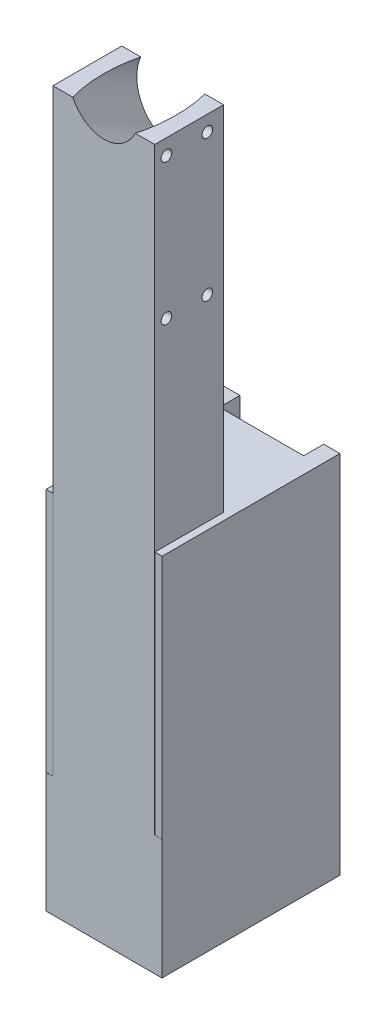
ISO-10303-21;
HEADER;
FILE_DESCRIPTION(('STEP AP214'),'2;1');
FILE_NAME('part.step','',(''),(''),'','','');
FILE_SCHEMA(('AUTOMOTIVE_DESIGN { 1 0 10303 214 1 1 1 1 }'));
ENDSEC;
DATA;
#1=APPLICATION_CONTEXT('core data for automotive mechanical design processes');
#2=APPLICATION_PROTOCOL_DEFINITION('international standard','automotive_design',2000,#1);
#3=PRODUCT_CONTEXT('',#1,'mechanical');
#4=PRODUCT('Part','Part','',(#3));
#5=PRODUCT_RELATED_PRODUCT_CATEGORY('part','',(#4));
#6=PRODUCT_DEFINITION_FORMATION('','',#4);
#7=PRODUCT_DEFINITION_CONTEXT('part definition',#1,'design');
#8=PRODUCT_DEFINITION('design','',#6,#7);
#9=PRODUCT_DEFINITION_SHAPE('','',#8);
#10=(LENGTH_UNIT() NAMED_UNIT(*) SI_UNIT(.MILLI.,.METRE.));
#11=(NAMED_UNIT(*) PLANE_ANGLE_UNIT() SI_UNIT($,.RADIAN.));
#12=(NAMED_UNIT(*) SI_UNIT($,.STERADIAN.) SOLID_ANGLE_UNIT());
#13=UNCERTAINTY_MEASURE_WITH_UNIT(LENGTH_MEASURE(1.E-05),#10,'distance_accuracy_value','');
#14=(GEOMETRIC_REPRESENTATION_CONTEXT(3) GLOBAL_UNCERTAINTY_ASSIGNED_CONTEXT((#13)) GLOBAL_UNIT_ASSIGNED_CONTEXT((#10,
#11,#12)) REPRESENTATION_CONTEXT('',''));
#15=CARTESIAN_POINT('',(0.,0.,0.));
#16=DIRECTION('',(0.,0.,1.));
#17=DIRECTION('',(1.,0.,0.));
#18=AXIS2_PLACEMENT_3D('',#15,#16,#17);
#19=CARTESIAN_POINT('',(4669.28789446627,-4525.12840812318,108.534705239457));
#20=DIRECTION('',(0.,1.,0.));
#21=DIRECTION('',(0.,0.,1.));
#22=AXIS2_PLACEMENT_3D('',#19,#20,#21);
#23=PLANE('',#22);
#24=DIRECTION('',(-1.,0.,0.));
#25=VECTOR('',#24,1.);
#26=CARTESIAN_POINT('',(4620.00818872536,-4525.12840812318,16.7710006429915));
#27=LINE('',#26,#25);
#28=CARTESIAN_POINT('',(4636.00818872536,-4525.12840812318,16.7710006429915));
#29=VERTEX_POINT('',#28);
#30=CARTESIAN_POINT('',(4620.00818872536,-4525.12840812318,16.7710006429915));
#31=VERTEX_POINT('',#30);
#32=EDGE_CURVE('E239',#29,#31,#27,.T.);
#33=ORIENTED_EDGE('',*,*,#32,.F.);
#34=DIRECTION('',(0.,0.,1.));
#35=VECTOR('',#34,1.);
#36=CARTESIAN_POINT('',(4636.00818872536,-4525.12840812318,11.7710006429915));
#37=LINE('',#36,#35);
#38=CARTESIAN_POINT('',(4636.00818872536,-4525.12840812318,11.7710006429915));
#39=VERTEX_POINT('',#38);
#40=EDGE_CURVE('E242',#39,#29,#37,.T.);
#41=ORIENTED_EDGE('',*,*,#40,.F.);
#42=DIRECTION('',(-1.,0.,0.));
#43=VECTOR('',#42,1.);
#44=CARTESIAN_POINT('',(4636.00818872536,-4525.12840812318,11.7710006429915));
#45=LINE('',#44,#43);
#46=CARTESIAN_POINT('',(4642.46950223067,-4525.12840812318,11.7710006429915));
#47=VERTEX_POINT('',#46);
#48=EDGE_CURVE('E245',#47,#39,#45,.T.);
#49=ORIENTED_EDGE('',*,*,#48,.F.);
#50=DIRECTION('',(0.,0.,-1.));
#51=VECTOR('',#50,1.);
#52=CARTESIAN_POINT('',(4642.46950223067,-4525.12840812318,11.7710006429915));
#53=LINE('',#52,#51);
#54=CARTESIAN_POINT('',(4642.46950223067,-4525.12840812318,56.1805924378811));
#55=VERTEX_POINT('',#54);
#56=EDGE_CURVE('E247',#55,#47,#53,.T.);
#57=ORIENTED_EDGE('',*,*,#56,.F.);
#58=DIRECTION('',(1.,0.,0.));
#59=VECTOR('',#58,1.);
#60=CARTESIAN_POINT('',(4615.26193548389,-4525.12840812318,56.1805924378811));
#61=LINE('',#60,#59);
#62=CARTESIAN_POINT('',(4613.54687522005,-4525.12840812318,56.1805924378811));
#63=VERTEX_POINT('',#62);
#64=EDGE_CURVE('E299',#63,#55,#61,.T.);
#65=ORIENTED_EDGE('',*,*,#64,.F.);
#66=DIRECTION('',(0.,0.,1.));
#67=VECTOR('',#66,1.);
#68=CARTESIAN_POINT('',(4613.54687522005,-4525.12840812318,56.1600064391853));
#69=LINE('',#68,#67);
#70=CARTESIAN_POINT('',(4613.54687522005,-4525.12840812318,11.6703669037885));
#71=VERTEX_POINT('',#70);
#72=EDGE_CURVE('E249',#71,#63,#69,.T.);
#73=ORIENTED_EDGE('',*,*,#72,.F.);
#74=DIRECTION('',(-1.,0.,0.));
#75=VECTOR('',#74,1.);
#76=CARTESIAN_POINT('',(4620.00818872535,-4525.12840812318,11.6703669037885));
#77=LINE('',#76,#75);
#78=CARTESIAN_POINT('',(4620.00818872535,-4525.12840812318,11.6703669037885));
#79=VERTEX_POINT('',#78);
#80=EDGE_CURVE('E251',#79,#71,#77,.T.);
#81=ORIENTED_EDGE('',*,*,#80,.F.);
#82=DIRECTION('',(-1.21891695342006E-12,0.,-1.));
#83=VECTOR('',#82,1.);
#84=CARTESIAN_POINT('',(4620.00818872536,-4525.12840812318,16.7710006429915));
#85=LINE('',#84,#83);
#86=EDGE_CURVE('E211',#31,#79,#85,.T.);
#87=ORIENTED_EDGE('',*,*,#86,.F.);
#88=EDGE_LOOP('',(#33,#41,#49,#57,#65,#73,#81,#87));
#89=FACE_BOUND('',#88,.T.);
#90=ADVANCED_FACE('F35',(#89),#23,.F.);
#91=CARTESIAN_POINT('',(4618.26193548389,-4349.73956554871,53.3144563773744));
#92=DIRECTION('',(-1.,0.,0.));
#93=DIRECTION('',(0.,-1.,0.));
#94=AXIS2_PLACEMENT_3D('',#91,#92,#93);
#95=PLANE('',#94);
#96=CARTESIAN_POINT('',(4618.26193548389,-4349.73956554871,53.3144563773744));
#97=DIRECTION('',(-1.,0.,0.));
#98=DIRECTION('',(0.,-1.,0.));
#99=AXIS2_PLACEMENT_3D('',#96,#97,#98);
#100=CIRCLE('',#99,1.32500000000007);
#101=CARTESIAN_POINT('',(4618.26193548389,-4351.06456554871,53.3144563773744));
#102=VERTEX_POINT('',#101);
#103=EDGE_CURVE('E336',#102,#102,#100,.T.);
#104=ORIENTED_EDGE('',*,*,#103,.T.);
#105=EDGE_LOOP('',(#104));
#106=FACE_BOUND('',#105,.T.);
#107=ADVANCED_FACE('F465',(#106),#95,.T.);
#108=CARTESIAN_POINT('',(4618.26193548389,-4349.73956554871,43.0468273602777));
#109=DIRECTION('',(-1.,0.,0.));
#110=DIRECTION('',(0.,-1.,0.));
#111=AXIS2_PLACEMENT_3D('',#108,#109,#110);
#112=PLANE('',#111);
#113=CARTESIAN_POINT('',(4618.26193548389,-4349.73956554871,43.0468273602777));
#114=DIRECTION('',(-1.,0.,0.));
#115=DIRECTION('',(0.,-1.,0.));
#116=AXIS2_PLACEMENT_3D('',#113,#114,#115);
#117=CIRCLE('',#116,1.32500000000007);
#118=CARTESIAN_POINT('',(4618.26193548389,-4351.06456554871,43.0468273602777));
#119=VERTEX_POINT('',#118);
#120=EDGE_CURVE('E332',#119,#119,#117,.T.);
#121=ORIENTED_EDGE('',*,*,#120,.T.);
#122=EDGE_LOOP('',(#121));
#123=FACE_BOUND('',#122,.T.);
#124=ADVANCED_FACE('F467',(#123),#112,.T.);
#125=CARTESIAN_POINT('',(4623.26193548389,-4384.90256348358,43.0468273602777));
#126=DIRECTION('',(-1.,0.,0.));
#127=DIRECTION('',(0.,-1.,0.));
#128=AXIS2_PLACEMENT_3D('',#125,#126,#127);
#129=PLANE('',#128);
#130=CARTESIAN_POINT('',(4623.26193548389,-4384.90256348358,43.0468273602777));
#131=DIRECTION('',(-1.,0.,0.));
#132=DIRECTION('',(0.,-1.,0.));
#133=AXIS2_PLACEMENT_3D('',#130,#131,#132);
#134=CIRCLE('',#133,1.32500000000007);
#135=CARTESIAN_POINT('',(4623.26193548389,-4386.22756348358,43.0468273602777));
#136=VERTEX_POINT('',#135);
#137=EDGE_CURVE('E314',#136,#136,#134,.T.);
#138=ORIENTED_EDGE('',*,*,#137,.T.);
#139=EDGE_LOOP('',(#138));
#140=FACE_BOUND('',#139,.T.);
#141=ADVANCED_FACE('F474',(#140),#129,.T.);
#142=CARTESIAN_POINT('',(4623.26193548389,-4384.90256348358,53.2520183883639));
#143=DIRECTION('',(-1.,0.,0.));
#144=DIRECTION('',(0.,-1.,0.));
#145=AXIS2_PLACEMENT_3D('',#142,#143,#144);
#146=PLANE('',#145);
#147=CARTESIAN_POINT('',(4623.26193548389,-4384.90256348358,53.2520183883639));
#148=DIRECTION('',(-1.,0.,0.));
#149=DIRECTION('',(0.,-1.,0.));
#150=AXIS2_PLACEMENT_3D('',#147,#148,#149);
#151=CIRCLE('',#150,1.32500000000007);
#152=CARTESIAN_POINT('',(4623.26193548389,-4386.22756348358,53.2520183883639));
#153=VERTEX_POINT('',#152);
#154=EDGE_CURVE('E310',#153,#153,#151,.T.);
#155=ORIENTED_EDGE('',*,*,#154,.T.);
#156=EDGE_LOOP('',(#155));
#157=FACE_BOUND('',#156,.T.);
#158=ADVANCED_FACE('F498',(#157),#146,.T.);
#159=CARTESIAN_POINT('',(4637.66193548389,-4349.73956554871,53.2520183883639));
#160=DIRECTION('',(1.,0.,0.));
#161=DIRECTION('',(0.,1.,0.));
#162=AXIS2_PLACEMENT_3D('',#159,#160,#161);
#163=PLANE('',#162);
#164=CARTESIAN_POINT('',(4637.66193548389,-4349.73956554871,53.2520183883639));
#165=DIRECTION('',(1.,0.,0.));
#166=DIRECTION('',(0.,1.,0.));
#167=AXIS2_PLACEMENT_3D('',#164,#165,#166);
#168=CIRCLE('',#167,1.32500000000007);
#169=CARTESIAN_POINT('',(4637.66193548389,-4348.41456554871,53.2520183883639));
#170=VERTEX_POINT('',#169);
#171=EDGE_CURVE('E335',#170,#170,#168,.T.);
#172=ORIENTED_EDGE('',*,*,#171,.T.);
#173=EDGE_LOOP('',(#172));
#174=FACE_BOUND('',#173,.T.);
#175=ADVANCED_FACE('F491',(#174),#163,.T.);
#176=CARTESIAN_POINT('',(4637.66193548389,-4349.73956554871,43.0468273602777));
#177=DIRECTION('',(1.,0.,0.));
#178=DIRECTION('',(0.,1.,0.));
#179=AXIS2_PLACEMENT_3D('',#176,#177,#178);
#180=PLANE('',#179);
#181=CARTESIAN_POINT('',(4637.66193548389,-4349.73956554871,43.0468273602777));
#182=DIRECTION('',(1.,0.,0.));
#183=DIRECTION('',(0.,1.,0.));
#184=AXIS2_PLACEMENT_3D('',#181,#182,#183);
#185=CIRCLE('',#184,1.32500000000007);
#186=CARTESIAN_POINT('',(4637.66193548389,-4348.41456554871,43.0468273602777));
#187=VERTEX_POINT('',#186);
#188=EDGE_CURVE('E344',#187,#187,#185,.T.);
#189=ORIENTED_EDGE('',*,*,#188,.T.);
#190=EDGE_LOOP('',(#189));
#191=FACE_BOUND('',#190,.T.);
#192=ADVANCED_FACE('F487',(#191),#180,.T.);
#193=CARTESIAN_POINT('',(4632.66193548389,-4384.90256348358,53.2520183883639));
#194=DIRECTION('',(1.,0.,0.));
#195=DIRECTION('',(0.,1.,0.));
#196=AXIS2_PLACEMENT_3D('',#193,#194,#195);
#197=PLANE('',#196);
#198=CARTESIAN_POINT('',(4632.66193548389,-4384.90256348358,53.2520183883639));
#199=DIRECTION('',(1.,0.,0.));
#200=DIRECTION('',(0.,1.,0.));
#201=AXIS2_PLACEMENT_3D('',#198,#199,#200);
#202=CIRCLE('',#201,1.32500000000007);
#203=CARTESIAN_POINT('',(4632.66193548389,-4383.57756348358,53.2520183883639));
#204=VERTEX_POINT('',#203);
#205=EDGE_CURVE('E322',#204,#204,#202,.T.);
#206=ORIENTED_EDGE('',*,*,#205,.T.);
#207=EDGE_LOOP('',(#206));
#208=FACE_BOUND('',#207,.T.);
#209=ADVANCED_FACE('F490',(#208),#197,.T.);
#210=CARTESIAN_POINT('',(4632.66193548389,-4384.90256348358,43.0468273602777));
#211=DIRECTION('',(1.,0.,0.));
#212=DIRECTION('',(0.,1.,0.));
#213=AXIS2_PLACEMENT_3D('',#210,#211,#212);
#214=PLANE('',#213);
#215=CARTESIAN_POINT('',(4632.66193548389,-4384.90256348358,43.0468273602777));
#216=DIRECTION('',(1.,0.,0.));
#217=DIRECTION('',(0.,1.,0.));
#218=AXIS2_PLACEMENT_3D('',#215,#216,#217);
#219=CIRCLE('',#218,1.32500000000007);
#220=CARTESIAN_POINT('',(4632.66193548389,-4383.57756348358,43.0468273602777));
#221=VERTEX_POINT('',#220);
#222=EDGE_CURVE('E318',#221,#221,#219,.T.);
#223=ORIENTED_EDGE('',*,*,#222,.T.);
#224=EDGE_LOOP('',(#223));
#225=FACE_BOUND('',#224,.T.);
#226=ADVANCED_FACE('F571',(#225),#214,.T.);
#227=CARTESIAN_POINT('',(4628.00818872536,-4491.71721595937,21.7710006429915));
#228=DIRECTION('',(0.,0.,-1.));
#229=DIRECTION('',(0.,1.,0.));
#230=AXIS2_PLACEMENT_3D('',#227,#228,#229);
#231=PLANE('',#230);
#232=CARTESIAN_POINT('',(4628.00818872536,-4491.71721595937,21.7710006429915));
#233=DIRECTION('',(0.,0.,-1.));
#234=DIRECTION('',(0.,1.,0.));
#235=AXIS2_PLACEMENT_3D('',#232,#233,#234);
#236=CIRCLE('',#235,1.40000000000023);
#237=CARTESIAN_POINT('',(4628.00818872536,-4490.31721595937,21.7710006429915));
#238=VERTEX_POINT('',#237);
#239=EDGE_CURVE('E254',#238,#238,#236,.T.);
#240=ORIENTED_EDGE('',*,*,#239,.T.);
#241=EDGE_LOOP('',(#240));
#242=FACE_BOUND('',#241,.T.);
#243=ADVANCED_FACE('F567',(#242),#231,.T.);
#244=CARTESIAN_POINT('',(4628.00818872536,-4445.65240812318,21.7710006429915));
#245=DIRECTION('',(0.,0.,-1.));
#246=DIRECTION('',(0.,1.,0.));
#247=AXIS2_PLACEMENT_3D('',#244,#245,#246);
#248=PLANE('',#247);
#249=CARTESIAN_POINT('',(4628.00818872536,-4445.65240812318,21.7710006429915));
#250=DIRECTION('',(0.,0.,-1.));
#251=DIRECTION('',(0.,1.,0.));
#252=AXIS2_PLACEMENT_3D('',#249,#250,#251);
#253=CIRCLE('',#252,1.40000000000023);
#254=CARTESIAN_POINT('',(4628.00818872536,-4444.25240812318,21.7710006429915));
#255=VERTEX_POINT('',#254);
#256=EDGE_CURVE('E271',#255,#255,#253,.T.);
#257=ORIENTED_EDGE('',*,*,#256,.T.);
#258=EDGE_LOOP('',(#257));
#259=FACE_BOUND('',#258,.T.);
#260=ADVANCED_FACE('F570',(#259),#248,.T.);
#261=CARTESIAN_POINT('',(4612.26193548389,-4349.73956554871,53.3144563773744));
#262=DIRECTION('',(1.,0.,0.));
#263=DIRECTION('',(0.,1.,0.));
#264=AXIS2_PLACEMENT_3D('',#261,#262,#263);
#265=CYLINDRICAL_SURFACE('',#264,1.32500000000007);
#266=ORIENTED_EDGE('',*,*,#103,.F.);
#267=EDGE_LOOP('',(#266));
#268=FACE_BOUND('',#267,.T.);
#269=CARTESIAN_POINT('',(4615.26193548389,-4349.73956554871,53.3144563773744));
#270=DIRECTION('',(1.,0.,0.));
#271=DIRECTION('',(0.,1.,0.));
#272=AXIS2_PLACEMENT_3D('',#269,#270,#271);
#273=CIRCLE('',#272,1.32500000000007);
#274=CARTESIAN_POINT('',(4615.26193548389,-4348.41456554871,53.3144563773744));
#275=VERTEX_POINT('',#274);
#276=EDGE_CURVE('E331',#275,#275,#273,.F.);
#277=ORIENTED_EDGE('',*,*,#276,.T.);
#278=EDGE_LOOP('',(#277));
#279=FACE_BOUND('',#278,.T.);
#280=ADVANCED_FACE('F480',(#268,#279),#265,.F.);
#281=CARTESIAN_POINT('',(4612.26193548389,-4349.73956554871,43.0468273602777));
#282=DIRECTION('',(1.,0.,0.));
#283=DIRECTION('',(0.,1.,0.));
#284=AXIS2_PLACEMENT_3D('',#281,#282,#283);
#285=CYLINDRICAL_SURFACE('',#284,1.32500000000007);
#286=ORIENTED_EDGE('',*,*,#120,.F.);
#287=EDGE_LOOP('',(#286));
#288=FACE_BOUND('',#287,.T.);
#289=CARTESIAN_POINT('',(4615.26193548389,-4349.73956554871,43.0468273602777));
#290=DIRECTION('',(1.,0.,0.));
#291=DIRECTION('',(0.,1.,0.));
#292=AXIS2_PLACEMENT_3D('',#289,#290,#291);
#293=CIRCLE('',#292,1.32500000000007);
#294=CARTESIAN_POINT('',(4615.26193548389,-4348.41456554871,43.0468273602777));
#295=VERTEX_POINT('',#294);
#296=EDGE_CURVE('E339',#295,#295,#293,.F.);
#297=ORIENTED_EDGE('',*,*,#296,.T.);
#298=EDGE_LOOP('',(#297));
#299=FACE_BOUND('',#298,.T.);
#300=ADVANCED_FACE('F599',(#288,#299),#285,.F.);
#301=CARTESIAN_POINT('',(4598.16748948172,-4384.90256348358,43.0468273602777));
#302=DIRECTION('',(1.,0.,0.));
#303=DIRECTION('',(0.,1.,0.));
#304=AXIS2_PLACEMENT_3D('',#301,#302,#303);
#305=CYLINDRICAL_SURFACE('',#304,1.32500000000007);
#306=ORIENTED_EDGE('',*,*,#137,.F.);
#307=EDGE_LOOP('',(#306));
#308=FACE_BOUND('',#307,.T.);
#309=CARTESIAN_POINT('',(4615.26193548389,-4384.90256348358,43.0468273602777));
#310=DIRECTION('',(1.,0.,0.));
#311=DIRECTION('',(0.,1.,0.));
#312=AXIS2_PLACEMENT_3D('',#309,#310,#311);
#313=CIRCLE('',#312,1.32500000000007);
#314=CARTESIAN_POINT('',(4615.26193548389,-4383.57756348358,43.0468273602777));
#315=VERTEX_POINT('',#314);
#316=EDGE_CURVE('E301',#315,#315,#313,.F.);
#317=ORIENTED_EDGE('',*,*,#316,.T.);
#318=EDGE_LOOP('',(#317));
#319=FACE_BOUND('',#318,.T.);
#320=ADVANCED_FACE('F592',(#308,#319),#305,.F.);
#321=CARTESIAN_POINT('',(4598.16748948172,-4384.90256348358,53.2520183883639));
#322=DIRECTION('',(1.,0.,0.));
#323=DIRECTION('',(0.,1.,0.));
#324=AXIS2_PLACEMENT_3D('',#321,#322,#323);
#325=CYLINDRICAL_SURFACE('',#324,1.32500000000007);
#326=ORIENTED_EDGE('',*,*,#154,.F.);
#327=EDGE_LOOP('',(#326));
#328=FACE_BOUND('',#327,.T.);
#329=CARTESIAN_POINT('',(4615.26193548389,-4384.90256348358,53.2520183883639));
#330=DIRECTION('',(1.,0.,0.));
#331=DIRECTION('',(0.,1.,0.));
#332=AXIS2_PLACEMENT_3D('',#329,#330,#331);
#333=CIRCLE('',#332,1.32500000000007);
#334=CARTESIAN_POINT('',(4615.26193548389,-4383.57756348358,53.2520183883639));
#335=VERTEX_POINT('',#334);
#336=EDGE_CURVE('E317',#335,#335,#333,.F.);
#337=ORIENTED_EDGE('',*,*,#336,.T.);
#338=EDGE_LOOP('',(#337));
#339=FACE_BOUND('',#338,.T.);
#340=ADVANCED_FACE('F586',(#328,#339),#325,.F.);
#341=CARTESIAN_POINT('',(4615.26193548389,-4315.19321890237,39.));
#342=DIRECTION('',(0.,0.,1.));
#343=DIRECTION('',(0.,-1.,0.));
#344=AXIS2_PLACEMENT_3D('',#341,#342,#343);
#345=PLANE('',#344);
#346=DIRECTION('',(1.,0.,0.));
#347=VECTOR('',#346,1.);
#348=CARTESIAN_POINT('',(4615.26193548389,-4345.85806451614,39.));
#349=LINE('',#348,#347);
#350=CARTESIAN_POINT('',(4615.26193548389,-4345.85806451614,39.));
#351=VERTEX_POINT('',#350);
#352=CARTESIAN_POINT('',(4619.990675141,-4345.85806451614,39.));
#353=VERTEX_POINT('',#352);
#354=EDGE_CURVE('E284',#351,#353,#349,.T.);
#355=ORIENTED_EDGE('',*,*,#354,.T.);
#356=CARTESIAN_POINT('',(4628.00246771943,-4350.59250283977,39.));
#357=DIRECTION('',(0.,0.,1.));
#358=DIRECTION('',(0.,1.,0.));
#359=AXIS2_PLACEMENT_3D('',#356,#357,#358);
#360=ELLIPSE('',#359,10.3923048454137,9.00000000000035);
#361=CARTESIAN_POINT('',(4636.01426029787,-4345.85806451614,39.));
#362=VERTEX_POINT('',#361);
#363=EDGE_CURVE('E321',#353,#362,#360,.T.);
#364=ORIENTED_EDGE('',*,*,#363,.T.);
#365=CARTESIAN_POINT('',(4640.66193548389,-4345.85806451614,39.));
#366=VERTEX_POINT('',#365);
#367=EDGE_CURVE('E287',#362,#366,#349,.T.);
#368=ORIENTED_EDGE('',*,*,#367,.T.);
#369=DIRECTION('',(0.,-1.,0.));
#370=VECTOR('',#369,1.);
#371=CARTESIAN_POINT('',(4640.66193548389,-4315.19321890237,39.));
#372=LINE('',#371,#370);
#373=CARTESIAN_POINT('',(4640.66193548389,-4433.96840812318,39.));
#374=VERTEX_POINT('',#373);
#375=EDGE_CURVE('E294',#366,#374,#372,.T.);
#376=ORIENTED_EDGE('',*,*,#375,.T.);
#377=DIRECTION('',(1.,0.,0.));
#378=VECTOR('',#377,1.);
#379=CARTESIAN_POINT('',(0.,-4433.96840812318,39.));
#380=LINE('',#379,#378);
#381=CARTESIAN_POINT('',(4615.26193548389,-4433.96840812318,38.9999999999999));
#382=VERTEX_POINT('',#381);
#383=EDGE_CURVE('E220',#382,#374,#380,.T.);
#384=ORIENTED_EDGE('',*,*,#383,.F.);
#385=DIRECTION('',(0.,-1.,0.));
#386=VECTOR('',#385,1.);
#387=CARTESIAN_POINT('',(4615.26193548389,-4315.19321890237,39.));
#388=LINE('',#387,#386);
#389=EDGE_CURVE('E297',#351,#382,#388,.T.);
#390=ORIENTED_EDGE('',*,*,#389,.F.);
#391=EDGE_LOOP('',(#355,#364,#368,#376,#384,#390));
#392=FACE_BOUND('',#391,.T.);
#393=ADVANCED_FACE('F427',(#392),#345,.F.);
#394=CARTESIAN_POINT('',(4637.66193548389,-4349.73956554871,53.2520183883639));
#395=DIRECTION('',(1.,0.,0.));
#396=DIRECTION('',(0.,1.,0.));
#397=AXIS2_PLACEMENT_3D('',#394,#395,#396);
#398=CYLINDRICAL_SURFACE('',#397,1.32500000000007);
#399=ORIENTED_EDGE('',*,*,#171,.F.);
#400=EDGE_LOOP('',(#399));
#401=FACE_BOUND('',#400,.T.);
#402=CARTESIAN_POINT('',(4640.66193548389,-4349.73956554871,53.2520183883639));
#403=DIRECTION('',(1.,0.,0.));
#404=DIRECTION('',(0.,1.,0.));
#405=AXIS2_PLACEMENT_3D('',#402,#403,#404);
#406=CIRCLE('',#405,1.32500000000007);
#407=CARTESIAN_POINT('',(4640.66193548389,-4348.41456554871,53.2520183883639));
#408=VERTEX_POINT('',#407);
#409=EDGE_CURVE('E347',#408,#408,#406,.T.);
#410=ORIENTED_EDGE('',*,*,#409,.T.);
#411=EDGE_LOOP('',(#410));
#412=FACE_BOUND('',#411,.T.);
#413=ADVANCED_FACE('F485',(#401,#412),#398,.F.);
#414=CARTESIAN_POINT('',(4637.66193548389,-4349.73956554871,43.0468273602777));
#415=DIRECTION('',(1.,0.,0.));
#416=DIRECTION('',(0.,1.,0.));
#417=AXIS2_PLACEMENT_3D('',#414,#415,#416);
#418=CYLINDRICAL_SURFACE('',#417,1.32500000000007);
#419=ORIENTED_EDGE('',*,*,#188,.F.);
#420=EDGE_LOOP('',(#419));
#421=FACE_BOUND('',#420,.T.);
#422=CARTESIAN_POINT('',(4640.66193548389,-4349.73956554871,43.0468273602777));
#423=DIRECTION('',(1.,0.,0.));
#424=DIRECTION('',(0.,1.,0.));
#425=AXIS2_PLACEMENT_3D('',#422,#423,#424);
#426=CIRCLE('',#425,1.32500000000007);
#427=CARTESIAN_POINT('',(4640.66193548389,-4348.41456554871,43.0468273602777));
#428=VERTEX_POINT('',#427);
#429=EDGE_CURVE('E340',#428,#428,#426,.T.);
#430=ORIENTED_EDGE('',*,*,#429,.T.);
#431=EDGE_LOOP('',(#430));
#432=FACE_BOUND('',#431,.T.);
#433=ADVANCED_FACE('F481',(#421,#432),#418,.F.);
#434=CARTESIAN_POINT('',(4655.66193548389,-4384.90256348358,53.2520183883639));
#435=DIRECTION('',(-1.,0.,0.));
#436=DIRECTION('',(0.,-1.,0.));
#437=AXIS2_PLACEMENT_3D('',#434,#435,#436);
#438=CYLINDRICAL_SURFACE('',#437,1.32500000000007);
#439=ORIENTED_EDGE('',*,*,#205,.F.);
#440=EDGE_LOOP('',(#439));
#441=FACE_BOUND('',#440,.T.);
#442=CARTESIAN_POINT('',(4640.66193548389,-4384.90256348358,53.2520183883639));
#443=DIRECTION('',(-1.,0.,0.));
#444=DIRECTION('',(0.,-1.,0.));
#445=AXIS2_PLACEMENT_3D('',#442,#443,#444);
#446=CIRCLE('',#445,1.32500000000007);
#447=CARTESIAN_POINT('',(4640.66193548389,-4386.22756348358,53.2520183883639));
#448=VERTEX_POINT('',#447);
#449=EDGE_CURVE('E313',#448,#448,#446,.F.);
#450=ORIENTED_EDGE('',*,*,#449,.T.);
#451=EDGE_LOOP('',(#450));
#452=FACE_BOUND('',#451,.T.);
#453=ADVANCED_FACE('F484',(#441,#452),#438,.F.);
#454=CARTESIAN_POINT('',(4655.66193548389,-4384.90256348358,43.0468273602777));
#455=DIRECTION('',(-1.,0.,0.));
#456=DIRECTION('',(0.,-1.,0.));
#457=AXIS2_PLACEMENT_3D('',#454,#455,#456);
#458=CYLINDRICAL_SURFACE('',#457,1.32500000000007);
#459=ORIENTED_EDGE('',*,*,#222,.F.);
#460=EDGE_LOOP('',(#459));
#461=FACE_BOUND('',#460,.T.);
#462=CARTESIAN_POINT('',(4640.66193548389,-4384.90256348358,43.0468273602777));
#463=DIRECTION('',(-1.,0.,0.));
#464=DIRECTION('',(0.,-1.,0.));
#465=AXIS2_PLACEMENT_3D('',#462,#463,#464);
#466=CIRCLE('',#465,1.32500000000007);
#467=CARTESIAN_POINT('',(4640.66193548389,-4386.22756348358,43.0468273602777));
#468=VERTEX_POINT('',#467);
#469=EDGE_CURVE('E325',#468,#468,#466,.F.);
#470=ORIENTED_EDGE('',*,*,#469,.T.);
#471=EDGE_LOOP('',(#470));
#472=FACE_BOUND('',#471,.T.);
#473=ADVANCED_FACE('F503',(#461,#472),#458,.F.);
#474=CARTESIAN_POINT('',(4617.43062735905,-4433.96840812318,91.5674320392537));
#475=DIRECTION('',(1.,0.,0.));
#476=DIRECTION('',(0.,1.,0.));
#477=AXIS2_PLACEMENT_3D('',#474,#475,#476);
#478=PLANE('',#477);
#479=DIRECTION('',(0.,-1.,0.));
#480=VECTOR('',#479,1.);
#481=CARTESIAN_POINT('',(4617.43062735905,-4433.96840812318,16.7710006429915));
#482=LINE('',#481,#480);
#483=CARTESIAN_POINT('',(4617.43062735905,-4433.96840812318,16.7710006429915));
#484=VERTEX_POINT('',#483);
#485=CARTESIAN_POINT('',(4617.43062735905,-4505.75880094356,16.7710006429915));
#486=VERTEX_POINT('',#485);
#487=EDGE_CURVE('E382',#484,#486,#482,.T.);
#488=ORIENTED_EDGE('',*,*,#487,.T.);
#489=DIRECTION('',(0.,0.,-1.));
#490=VECTOR('',#489,1.);
#491=CARTESIAN_POINT('',(4617.43062735905,-4505.75880094356,91.5674320392537));
#492=LINE('',#491,#490);
#493=CARTESIAN_POINT('',(4617.43062735905,-4505.75880094356,11.6703669037885));
#494=VERTEX_POINT('',#493);
#495=EDGE_CURVE('E208',#486,#494,#492,.T.);
#496=ORIENTED_EDGE('',*,*,#495,.T.);
#497=DIRECTION('',(0.,-1.,0.));
#498=VECTOR('',#497,1.);
#499=CARTESIAN_POINT('',(4617.43062735905,-4433.96840812318,11.6703669037885));
#500=LINE('',#499,#498);
#501=CARTESIAN_POINT('',(4617.43062735905,-4433.96840812318,11.6703669037885));
#502=VERTEX_POINT('',#501);
#503=EDGE_CURVE('E44',#502,#494,#500,.T.);
#504=ORIENTED_EDGE('',*,*,#503,.F.);
#505=DIRECTION('',(0.,0.,-1.));
#506=VECTOR('',#505,1.);
#507=CARTESIAN_POINT('',(4617.43062735905,-4433.96840812318,91.5674320392537));
#508=LINE('',#507,#506);
#509=EDGE_CURVE('E11',#484,#502,#508,.T.);
#510=ORIENTED_EDGE('',*,*,#509,.F.);
#511=EDGE_LOOP('',(#488,#496,#504,#510));
#512=FACE_BOUND('',#511,.T.);
#513=ADVANCED_FACE('F464',(#512),#478,.T.);
#514=CARTESIAN_POINT('',(4617.43062735905,-4505.75880094356,91.5674320392537));
#515=DIRECTION('',(0.,1.,0.));
#516=DIRECTION('',(0.,0.,1.));
#517=AXIS2_PLACEMENT_3D('',#514,#515,#516);
#518=PLANE('',#517);
#519=DIRECTION('',(-1.21891695342006E-12,0.,-1.));
#520=VECTOR('',#519,1.);
#521=CARTESIAN_POINT('',(4620.00818872536,-4505.75880094356,16.7710006429915));
#522=LINE('',#521,#520);
#523=CARTESIAN_POINT('',(4620.00818872536,-4505.75880094356,16.7710006429915));
#524=VERTEX_POINT('',#523);
#525=CARTESIAN_POINT('',(4620.00818872535,-4505.75880094356,11.6703669037885));
#526=VERTEX_POINT('',#525);
#527=EDGE_CURVE('E193',#524,#526,#522,.T.);
#528=ORIENTED_EDGE('',*,*,#527,.T.);
#529=DIRECTION('',(1.,0.,0.));
#530=VECTOR('',#529,1.);
#531=CARTESIAN_POINT('',(4617.43062735905,-4505.75880094356,11.6703669037885));
#532=LINE('',#531,#530);
#533=EDGE_CURVE('E38',#494,#526,#532,.T.);
#534=ORIENTED_EDGE('',*,*,#533,.F.);
#535=ORIENTED_EDGE('',*,*,#495,.F.);
#536=DIRECTION('',(1.,0.,0.));
#537=VECTOR('',#536,1.);
#538=CARTESIAN_POINT('',(4617.43062735905,-4505.75880094356,16.7710006429915));
#539=LINE('',#538,#537);
#540=EDGE_CURVE('E82',#486,#524,#539,.T.);
#541=ORIENTED_EDGE('',*,*,#540,.T.);
#542=EDGE_LOOP('',(#528,#534,#535,#541));
#543=FACE_BOUND('',#542,.T.);
#544=ADVANCED_FACE('F195',(#543),#518,.T.);
#545=CARTESIAN_POINT('',(4620.00818872536,-4433.96840812318,16.7710006429915));
#546=DIRECTION('',(-1.,0.,1.21891695342006E-12));
#547=DIRECTION('',(1.21891695342006E-12,0.,1.));
#548=AXIS2_PLACEMENT_3D('',#545,#546,#547);
#549=PLANE('',#548);
#550=ORIENTED_EDGE('',*,*,#527,.F.);
#551=DIRECTION('',(0.,-1.,0.));
#552=VECTOR('',#551,1.);
#553=CARTESIAN_POINT('',(4620.00818872536,-4433.96840812318,16.7710006429915));
#554=LINE('',#553,#552);
#555=EDGE_CURVE('E237',#524,#31,#554,.T.);
#556=ORIENTED_EDGE('',*,*,#555,.T.);
#557=ORIENTED_EDGE('',*,*,#86,.T.);
#558=DIRECTION('',(0.,-1.,0.));
#559=VECTOR('',#558,1.);
#560=CARTESIAN_POINT('',(4620.00818872535,-4433.96840812318,11.6703669037885));
#561=LINE('',#560,#559);
#562=EDGE_CURVE('E206',#526,#79,#561,.T.);
#563=ORIENTED_EDGE('',*,*,#562,.F.);
#564=EDGE_LOOP('',(#550,#556,#557,#563));
#565=FACE_BOUND('',#564,.T.);
#566=ADVANCED_FACE('F210',(#565),#549,.F.);
#567=CARTESIAN_POINT('',(4636.00818872536,-4433.96840812318,11.7710006429915));
#568=DIRECTION('',(1.,0.,0.));
#569=DIRECTION('',(0.,1.,0.));
#570=AXIS2_PLACEMENT_3D('',#567,#568,#569);
#571=PLANE('',#570);
#572=DIRECTION('',(0.,0.,1.));
#573=VECTOR('',#572,1.);
#574=CARTESIAN_POINT('',(4636.00818872536,-4505.75880094356,11.7710006429915));
#575=LINE('',#574,#573);
#576=CARTESIAN_POINT('',(4636.00818872536,-4505.75880094356,11.7710006429915));
#577=VERTEX_POINT('',#576);
#578=CARTESIAN_POINT('',(4636.00818872536,-4505.75880094356,16.7710006429915));
#579=VERTEX_POINT('',#578);
#580=EDGE_CURVE('E377',#577,#579,#575,.T.);
#581=ORIENTED_EDGE('',*,*,#580,.F.);
#582=DIRECTION('',(0.,-1.,0.));
#583=VECTOR('',#582,1.);
#584=CARTESIAN_POINT('',(4636.00818872536,-4433.96840812318,11.7710006429915));
#585=LINE('',#584,#583);
#586=EDGE_CURVE('E231',#577,#39,#585,.T.);
#587=ORIENTED_EDGE('',*,*,#586,.T.);
#588=ORIENTED_EDGE('',*,*,#40,.T.);
#589=DIRECTION('',(0.,-1.,0.));
#590=VECTOR('',#589,1.);
#591=CARTESIAN_POINT('',(4636.00818872536,-4433.96840812318,16.7710006429915));
#592=LINE('',#591,#590);
#593=EDGE_CURVE('E234',#579,#29,#592,.T.);
#594=ORIENTED_EDGE('',*,*,#593,.F.);
#595=EDGE_LOOP('',(#581,#587,#588,#594));
#596=FACE_BOUND('',#595,.T.);
#597=ADVANCED_FACE('F451',(#596),#571,.F.);
#598=CARTESIAN_POINT('',(4638.42218871858,-4433.96840812318,91.5674320392537));
#599=DIRECTION('',(-1.,0.,0.));
#600=DIRECTION('',(0.,-1.,0.));
#601=AXIS2_PLACEMENT_3D('',#598,#599,#600);
#602=PLANE('',#601);
#603=DIRECTION('',(0.,-1.,0.));
#604=VECTOR('',#603,1.);
#605=CARTESIAN_POINT('',(4638.42218871858,-4433.96840812318,11.7710006429915));
#606=LINE('',#605,#604);
#607=CARTESIAN_POINT('',(4638.42218871858,-4433.96840812318,11.7710006429915));
#608=VERTEX_POINT('',#607);
#609=CARTESIAN_POINT('',(4638.42218871858,-4505.75880094356,11.7710006429915));
#610=VERTEX_POINT('',#609);
#611=EDGE_CURVE('E399',#608,#610,#606,.T.);
#612=ORIENTED_EDGE('',*,*,#611,.T.);
#613=DIRECTION('',(0.,0.,-1.));
#614=VECTOR('',#613,1.);
#615=CARTESIAN_POINT('',(4638.42218871858,-4505.75880094356,91.5674320392537));
#616=LINE('',#615,#614);
#617=CARTESIAN_POINT('',(4638.42218871858,-4505.75880094356,16.7710006429915));
#618=VERTEX_POINT('',#617);
#619=EDGE_CURVE('E209',#618,#610,#616,.T.);
#620=ORIENTED_EDGE('',*,*,#619,.F.);
#621=DIRECTION('',(0.,1.,0.));
#622=VECTOR('',#621,1.);
#623=CARTESIAN_POINT('',(4638.42218871858,-4433.96840812318,16.7710006429915));
#624=LINE('',#623,#622);
#625=CARTESIAN_POINT('',(4638.42218871858,-4433.96840812318,16.7710006429915));
#626=VERTEX_POINT('',#625);
#627=EDGE_CURVE('E378',#618,#626,#624,.T.);
#628=ORIENTED_EDGE('',*,*,#627,.T.);
#629=DIRECTION('',(0.,0.,-1.));
#630=VECTOR('',#629,1.);
#631=CARTESIAN_POINT('',(4638.42218871858,-4433.96840812318,91.5674320392537));
#632=LINE('',#631,#630);
#633=EDGE_CURVE('E380',#626,#608,#632,.T.);
#634=ORIENTED_EDGE('',*,*,#633,.T.);
#635=EDGE_LOOP('',(#612,#620,#628,#634));
#636=FACE_BOUND('',#635,.T.);
#637=ADVANCED_FACE('F390',(#636),#602,.T.);
#638=DIRECTION('',(-1.,0.,0.));
#639=VECTOR('',#638,1.);
#640=CARTESIAN_POINT('',(4636.00818872536,-4505.75880094356,11.7710006429915));
#641=LINE('',#640,#639);
#642=EDGE_CURVE('E200',#610,#577,#641,.T.);
#643=ORIENTED_EDGE('',*,*,#642,.T.);
#644=ORIENTED_EDGE('',*,*,#580,.T.);
#645=EDGE_CURVE('E66',#579,#618,#539,.T.);
#646=ORIENTED_EDGE('',*,*,#645,.T.);
#647=ORIENTED_EDGE('',*,*,#619,.T.);
#648=EDGE_LOOP('',(#643,#644,#646,#647));
#649=FACE_BOUND('',#648,.T.);
#650=ADVANCED_FACE('F453',(#649),#518,.T.);
#651=CARTESIAN_POINT('',(4620.00818872535,-4433.96840812318,11.6703669037885));
#652=DIRECTION('',(0.,0.,1.));
#653=DIRECTION('',(0.,-1.,0.));
#654=AXIS2_PLACEMENT_3D('',#651,#652,#653);
#655=PLANE('',#654);
#656=ORIENTED_EDGE('',*,*,#503,.T.);
#657=ORIENTED_EDGE('',*,*,#533,.T.);
#658=ORIENTED_EDGE('',*,*,#562,.T.);
#659=ORIENTED_EDGE('',*,*,#80,.T.);
#660=DIRECTION('',(0.,-1.,0.));
#661=VECTOR('',#660,1.);
#662=CARTESIAN_POINT('',(4613.54687522005,-4433.96840812318,11.6703669037885));
#663=LINE('',#662,#661);
#664=CARTESIAN_POINT('',(4613.54687522005,-4433.96840812318,11.6703669037885));
#665=VERTEX_POINT('',#664);
#666=EDGE_CURVE('E213',#665,#71,#663,.T.);
#667=ORIENTED_EDGE('',*,*,#666,.F.);
#668=DIRECTION('',(-1.,0.,0.));
#669=VECTOR('',#668,1.);
#670=CARTESIAN_POINT('',(4620.00818872535,-4433.96840812318,11.6703669037885));
#671=LINE('',#670,#669);
#672=EDGE_CURVE('E243',#502,#665,#671,.T.);
#673=ORIENTED_EDGE('',*,*,#672,.F.);
#674=EDGE_LOOP('',(#656,#657,#658,#659,#667,#673));
#675=FACE_BOUND('',#674,.T.);
#676=ADVANCED_FACE('F205',(#675),#655,.F.);
#677=CARTESIAN_POINT('',(4636.00818872535,-4433.96840812318,56.1600064391854));
#678=DIRECTION('',(0.,0.,-1.));
#679=DIRECTION('',(0.,1.,0.));
#680=AXIS2_PLACEMENT_3D('',#677,#678,#679);
#681=PLANE('',#680);
#682=DIRECTION('',(-1.,0.,0.));
#683=VECTOR('',#682,1.);
#684=CARTESIAN_POINT('',(0.,-4495.12840812318,56.1600064391853));
#685=LINE('',#684,#683);
#686=CARTESIAN_POINT('',(4615.26193548389,-4495.12840812318,56.1600064391853));
#687=VERTEX_POINT('',#686);
#688=CARTESIAN_POINT('',(4613.54687522005,-4495.12840812318,56.1600064391853));
#689=VERTEX_POINT('',#688);
#690=EDGE_CURVE('E369',#687,#689,#685,.T.);
#691=ORIENTED_EDGE('',*,*,#690,.F.);
#692=DIRECTION('',(0.,-1.,0.));
#693=VECTOR('',#692,1.);
#694=CARTESIAN_POINT('',(4615.26193548389,-4433.96840812318,56.1600064391854));
#695=LINE('',#694,#693);
#696=CARTESIAN_POINT('',(4615.26193548389,-4433.96840812318,56.1600064391854));
#697=VERTEX_POINT('',#696);
#698=EDGE_CURVE('E281',#697,#687,#695,.T.);
#699=ORIENTED_EDGE('',*,*,#698,.F.);
#700=DIRECTION('',(1.,0.,0.));
#701=VECTOR('',#700,1.);
#702=CARTESIAN_POINT('',(4620.00818872536,-4433.96840812318,56.1600064391854));
#703=LINE('',#702,#701);
#704=CARTESIAN_POINT('',(4613.54687522005,-4433.96840812318,56.1600064391854));
#705=VERTEX_POINT('',#704);
#706=EDGE_CURVE('E261',#705,#697,#703,.T.);
#707=ORIENTED_EDGE('',*,*,#706,.F.);
#708=DIRECTION('',(0.,-1.,0.));
#709=VECTOR('',#708,1.);
#710=CARTESIAN_POINT('',(4613.54687522005,-4433.96840812318,56.1600064391854));
#711=LINE('',#710,#709);
#712=EDGE_CURVE('E217',#705,#689,#711,.T.);
#713=ORIENTED_EDGE('',*,*,#712,.T.);
#714=EDGE_LOOP('',(#691,#699,#707,#713));
#715=FACE_BOUND('',#714,.T.);
#716=ADVANCED_FACE('F460',(#715),#681,.F.);
#717=CARTESIAN_POINT('',(4642.46950223067,-4495.12840812318,56.1600064391853));
#718=VERTEX_POINT('',#717);
#719=CARTESIAN_POINT('',(4640.66193548389,-4495.12840812318,56.1600064391853));
#720=VERTEX_POINT('',#719);
#721=EDGE_CURVE('E360',#718,#720,#685,.T.);
#722=ORIENTED_EDGE('',*,*,#721,.F.);
#723=DIRECTION('',(0.,-1.,0.));
#724=VECTOR('',#723,1.);
#725=CARTESIAN_POINT('',(4642.46950223067,-4433.96840812318,56.1600064391854));
#726=LINE('',#725,#724);
#727=CARTESIAN_POINT('',(4642.46950223067,-4433.96840812318,56.1600064391854));
#728=VERTEX_POINT('',#727);
#729=EDGE_CURVE('E225',#728,#718,#726,.T.);
#730=ORIENTED_EDGE('',*,*,#729,.F.);
#731=CARTESIAN_POINT('',(4640.66193548389,-4433.96840812318,56.1600064391854));
#732=VERTEX_POINT('',#731);
#733=EDGE_CURVE('E264',#732,#728,#703,.T.);
#734=ORIENTED_EDGE('',*,*,#733,.F.);
#735=DIRECTION('',(0.,1.,0.));
#736=VECTOR('',#735,1.);
#737=CARTESIAN_POINT('',(4640.66193548389,-4433.96840812318,56.1600064391854));
#738=LINE('',#737,#736);
#739=EDGE_CURVE('E277',#720,#732,#738,.T.);
#740=ORIENTED_EDGE('',*,*,#739,.F.);
#741=EDGE_LOOP('',(#722,#730,#734,#740));
#742=FACE_BOUND('',#741,.T.);
#743=ADVANCED_FACE('F435',(#742),#681,.F.);
#744=CARTESIAN_POINT('',(0.,-4433.96840812318,0.));
#745=DIRECTION('',(0.,1.,0.));
#746=DIRECTION('',(0.,0.,1.));
#747=AXIS2_PLACEMENT_3D('',#744,#745,#746);
#748=PLANE('',#747);
#749=DIRECTION('',(-1.,0.,0.));
#750=VECTOR('',#749,1.);
#751=CARTESIAN_POINT('',(4620.00818872536,-4433.96840812318,16.7710006429915));
#752=LINE('',#751,#750);
#753=EDGE_CURVE('E72',#626,#484,#752,.T.);
#754=ORIENTED_EDGE('',*,*,#753,.T.);
#755=ORIENTED_EDGE('',*,*,#509,.T.);
#756=ORIENTED_EDGE('',*,*,#672,.T.);
#757=DIRECTION('',(0.,0.,1.));
#758=VECTOR('',#757,1.);
#759=CARTESIAN_POINT('',(4613.54687522005,-4433.96840812318,56.1600064391854));
#760=LINE('',#759,#758);
#761=EDGE_CURVE('E265',#665,#705,#760,.T.);
#762=ORIENTED_EDGE('',*,*,#761,.T.);
#763=ORIENTED_EDGE('',*,*,#706,.T.);
#764=DIRECTION('',(0.,0.,-1.));
#765=VECTOR('',#764,1.);
#766=CARTESIAN_POINT('',(4615.26193548389,-4433.96840812318,0.));
#767=LINE('',#766,#765);
#768=EDGE_CURVE('E214',#697,#382,#767,.T.);
#769=ORIENTED_EDGE('',*,*,#768,.T.);
#770=ORIENTED_EDGE('',*,*,#383,.T.);
#771=DIRECTION('',(0.,0.,1.));
#772=VECTOR('',#771,1.);
#773=CARTESIAN_POINT('',(4640.66193548389,-4433.96840812318,0.));
#774=LINE('',#773,#772);
#775=EDGE_CURVE('E412',#374,#732,#774,.T.);
#776=ORIENTED_EDGE('',*,*,#775,.T.);
#777=ORIENTED_EDGE('',*,*,#733,.T.);
#778=DIRECTION('',(0.,0.,-1.));
#779=VECTOR('',#778,1.);
#780=CARTESIAN_POINT('',(4642.46950223067,-4433.96840812318,11.7710006429915));
#781=LINE('',#780,#779);
#782=CARTESIAN_POINT('',(4642.46950223067,-4433.96840812318,11.7710006429915));
#783=VERTEX_POINT('',#782);
#784=EDGE_CURVE('E259',#728,#783,#781,.T.);
#785=ORIENTED_EDGE('',*,*,#784,.T.);
#786=DIRECTION('',(-1.,0.,0.));
#787=VECTOR('',#786,1.);
#788=CARTESIAN_POINT('',(4636.00818872536,-4433.96840812318,11.7710006429915));
#789=LINE('',#788,#787);
#790=EDGE_CURVE('E256',#783,#608,#789,.T.);
#791=ORIENTED_EDGE('',*,*,#790,.T.);
#792=ORIENTED_EDGE('',*,*,#633,.F.);
#793=EDGE_LOOP('',(#754,#755,#756,#762,#763,#769,#770,#776,#777,#785,#791,#792));
#794=FACE_BOUND('',#793,.T.);
#795=ADVANCED_FACE('F392',(#794),#748,.T.);
#796=CARTESIAN_POINT('',(4636.00818872536,-4433.96840812318,11.7710006429915));
#797=DIRECTION('',(0.,0.,1.));
#798=DIRECTION('',(0.,-1.,0.));
#799=AXIS2_PLACEMENT_3D('',#796,#797,#798);
#800=PLANE('',#799);
#801=ORIENTED_EDGE('',*,*,#642,.F.);
#802=ORIENTED_EDGE('',*,*,#611,.F.);
#803=ORIENTED_EDGE('',*,*,#790,.F.);
#804=DIRECTION('',(0.,-1.,0.));
#805=VECTOR('',#804,1.);
#806=CARTESIAN_POINT('',(4642.46950223067,-4433.96840812318,11.7710006429915));
#807=LINE('',#806,#805);
#808=EDGE_CURVE('E228',#783,#47,#807,.T.);
#809=ORIENTED_EDGE('',*,*,#808,.T.);
#810=ORIENTED_EDGE('',*,*,#48,.T.);
#811=ORIENTED_EDGE('',*,*,#586,.F.);
#812=EDGE_LOOP('',(#801,#802,#803,#809,#810,#811));
#813=FACE_BOUND('',#812,.T.);
#814=ADVANCED_FACE('F398',(#813),#800,.F.);
#815=CARTESIAN_POINT('',(4613.54687522005,-4433.96840812318,56.1600064391854));
#816=DIRECTION('',(1.,0.,0.));
#817=DIRECTION('',(0.,1.,0.));
#818=AXIS2_PLACEMENT_3D('',#815,#816,#817);
#819=PLANE('',#818);
#820=ORIENTED_EDGE('',*,*,#72,.T.);
#821=DIRECTION('',(0.,-1.,0.));
#822=VECTOR('',#821,1.);
#823=CARTESIAN_POINT('',(4613.54687522005,-4466.20577378641,56.1805924378811));
#824=LINE('',#823,#822);
#825=CARTESIAN_POINT('',(4613.54687522005,-4495.12840812318,56.1805924378811));
#826=VERTEX_POINT('',#825);
#827=EDGE_CURVE('E361',#826,#63,#824,.T.);
#828=ORIENTED_EDGE('',*,*,#827,.F.);
#829=DIRECTION('',(0.,0.,-1.));
#830=VECTOR('',#829,1.);
#831=CARTESIAN_POINT('',(4613.54687522005,-4495.12840812318,0.));
#832=LINE('',#831,#830);
#833=EDGE_CURVE('E370',#826,#689,#832,.T.);
#834=ORIENTED_EDGE('',*,*,#833,.T.);
#835=ORIENTED_EDGE('',*,*,#712,.F.);
#836=ORIENTED_EDGE('',*,*,#761,.F.);
#837=ORIENTED_EDGE('',*,*,#666,.T.);
#838=EDGE_LOOP('',(#820,#828,#834,#835,#836,#837));
#839=FACE_BOUND('',#838,.T.);
#840=ADVANCED_FACE('F514',(#839),#819,.F.);
#841=CARTESIAN_POINT('',(0.,-4495.12840812318,0.));
#842=DIRECTION('',(0.,-1.,0.));
#843=DIRECTION('',(0.,0.,-1.));
#844=AXIS2_PLACEMENT_3D('',#841,#842,#843);
#845=PLANE('',#844);
#846=DIRECTION('',(-1.,0.,0.));
#847=VECTOR('',#846,1.);
#848=CARTESIAN_POINT('',(0.,-4495.12840812318,56.1805924378811));
#849=LINE('',#848,#847);
#850=CARTESIAN_POINT('',(4615.26193548389,-4495.12840812318,56.1805924378811));
#851=VERTEX_POINT('',#850);
#852=EDGE_CURVE('E364',#851,#826,#849,.T.);
#853=ORIENTED_EDGE('',*,*,#852,.F.);
#854=DIRECTION('',(0.,0.,-1.));
#855=VECTOR('',#854,1.);
#856=CARTESIAN_POINT('',(4615.26193548389,-4495.12840812318,39.));
#857=LINE('',#856,#855);
#858=EDGE_CURVE('E354',#851,#687,#857,.T.);
#859=ORIENTED_EDGE('',*,*,#858,.T.);
#860=ORIENTED_EDGE('',*,*,#690,.T.);
#861=ORIENTED_EDGE('',*,*,#833,.F.);
#862=EDGE_LOOP('',(#853,#859,#860,#861));
#863=FACE_BOUND('',#862,.T.);
#864=ADVANCED_FACE('F501',(#863),#845,.F.);
#865=CARTESIAN_POINT('',(4615.26193548389,-4315.19321890237,39.));
#866=DIRECTION('',(1.,0.,0.));
#867=DIRECTION('',(0.,1.,0.));
#868=AXIS2_PLACEMENT_3D('',#865,#866,#867);
#869=PLANE('',#868);
#870=ORIENTED_EDGE('',*,*,#336,.F.);
#871=EDGE_LOOP('',(#870));
#872=FACE_BOUND('',#871,.T.);
#873=ORIENTED_EDGE('',*,*,#316,.F.);
#874=EDGE_LOOP('',(#873));
#875=FACE_BOUND('',#874,.T.);
#876=ORIENTED_EDGE('',*,*,#296,.F.);
#877=EDGE_LOOP('',(#876));
#878=FACE_BOUND('',#877,.T.);
#879=ORIENTED_EDGE('',*,*,#276,.F.);
#880=EDGE_LOOP('',(#879));
#881=FACE_BOUND('',#880,.T.);
#882=ORIENTED_EDGE('',*,*,#858,.F.);
#883=DIRECTION('',(0.,-1.,0.));
#884=VECTOR('',#883,1.);
#885=CARTESIAN_POINT('',(4615.26193548389,-4315.19321890237,56.1805924378812));
#886=LINE('',#885,#884);
#887=CARTESIAN_POINT('',(4615.26193548389,-4345.85806451614,56.1805924378812));
#888=VERTEX_POINT('',#887);
#889=EDGE_CURVE('E289',#888,#851,#886,.T.);
#890=ORIENTED_EDGE('',*,*,#889,.F.);
#891=DIRECTION('',(0.,0.,-1.));
#892=VECTOR('',#891,1.);
#893=CARTESIAN_POINT('',(4615.26193548389,-4345.85806451614,39.));
#894=LINE('',#893,#892);
#895=EDGE_CURVE('E283',#888,#351,#894,.T.);
#896=ORIENTED_EDGE('',*,*,#895,.T.);
#897=ORIENTED_EDGE('',*,*,#389,.T.);
#898=ORIENTED_EDGE('',*,*,#768,.F.);
#899=ORIENTED_EDGE('',*,*,#698,.T.);
#900=EDGE_LOOP('',(#882,#890,#896,#897,#898,#899));
#901=FACE_BOUND('',#900,.T.);
#902=ADVANCED_FACE('F521',(#872,#875,#878,#881,#901),#869,.F.);
#903=CARTESIAN_POINT('',(4640.66193548388,-4345.85806451614,10.7710006429907));
#904=DIRECTION('',(0.,-1.,0.));
#905=DIRECTION('',(0.,0.,1.));
#906=AXIS2_PLACEMENT_3D('',#903,#904,#905);
#907=PLANE('',#906);
#908=DIRECTION('',(-1.,0.,0.));
#909=VECTOR('',#908,1.);
#910=CARTESIAN_POINT('',(4615.26193548389,-4345.85806451614,56.1805924378812));
#911=LINE('',#910,#909);
#912=CARTESIAN_POINT('',(4620.20256183528,-4345.85806451614,56.1805924378812));
#913=VERTEX_POINT('',#912);
#914=EDGE_CURVE('E307',#913,#888,#911,.T.);
#915=ORIENTED_EDGE('',*,*,#914,.F.);
#916=CARTESIAN_POINT('',(4628.00246771943,-4345.85806451614,47.2002877218144));
#917=DIRECTION('',(0.,-1.,0.));
#918=DIRECTION('',(0.,0.,1.));
#919=AXIS2_PLACEMENT_3D('',#916,#917,#918);
#920=ELLIPSE('',#919,18.0000000000008,9.00000000000035);
#921=EDGE_CURVE('E401',#913,#353,#920,.T.);
#922=ORIENTED_EDGE('',*,*,#921,.T.);
#923=ORIENTED_EDGE('',*,*,#354,.F.);
#924=ORIENTED_EDGE('',*,*,#895,.F.);
#925=EDGE_LOOP('',(#915,#922,#923,#924));
#926=FACE_BOUND('',#925,.T.);
#927=ADVANCED_FACE('F526',(#926),#907,.F.);
#928=CARTESIAN_POINT('',(4628.00246771943,-4424.96947850723,-89.8247007693626));
#929=DIRECTION('',(0.,0.499999999999998,0.86602540378444));
#930=DIRECTION('',(0.,-0.86602540378444,0.499999999999998));
#931=AXIS2_PLACEMENT_3D('',#928,#929,#930);
#932=CYLINDRICAL_SURFACE('',#931,9.00000000000035);
#933=CARTESIAN_POINT('',(4628.00246771943,-4340.67328317092,56.1805924378812));
#934=DIRECTION('',(0.,0.,-1.));
#935=DIRECTION('',(0.,1.,0.));
#936=AXIS2_PLACEMENT_3D('',#933,#934,#935);
#937=ELLIPSE('',#936,10.3923048454137,9.00000000000035);
#938=CARTESIAN_POINT('',(4635.80237360358,-4345.85806451614,56.1805924378812));
#939=VERTEX_POINT('',#938);
#940=EDGE_CURVE('E328',#939,#913,#937,.T.);
#941=ORIENTED_EDGE('',*,*,#940,.F.);
#942=EDGE_CURVE('E404',#362,#939,#920,.T.);
#943=ORIENTED_EDGE('',*,*,#942,.F.);
#944=ORIENTED_EDGE('',*,*,#363,.F.);
#945=ORIENTED_EDGE('',*,*,#921,.F.);
#946=EDGE_LOOP('',(#941,#943,#944,#945));
#947=FACE_BOUND('',#946,.T.);
#948=ADVANCED_FACE('F589',(#947),#932,.F.);
#949=ORIENTED_EDGE('',*,*,#367,.F.);
#950=ORIENTED_EDGE('',*,*,#942,.T.);
#951=CARTESIAN_POINT('',(4640.66193548389,-4345.85806451614,56.1805924378812));
#952=VERTEX_POINT('',#951);
#953=EDGE_CURVE('E304',#952,#939,#911,.T.);
#954=ORIENTED_EDGE('',*,*,#953,.F.);
#955=DIRECTION('',(0.,0.,1.));
#956=VECTOR('',#955,1.);
#957=CARTESIAN_POINT('',(4640.66193548389,-4345.85806451614,39.));
#958=LINE('',#957,#956);
#959=EDGE_CURVE('E288',#366,#952,#958,.T.);
#960=ORIENTED_EDGE('',*,*,#959,.F.);
#961=EDGE_LOOP('',(#949,#950,#954,#960));
#962=FACE_BOUND('',#961,.T.);
#963=ADVANCED_FACE('F529',(#962),#907,.F.);
#964=CARTESIAN_POINT('',(4640.66193548389,-4315.19321890237,39.));
#965=DIRECTION('',(-1.,0.,0.));
#966=DIRECTION('',(0.,-1.,0.));
#967=AXIS2_PLACEMENT_3D('',#964,#965,#966);
#968=PLANE('',#967);
#969=ORIENTED_EDGE('',*,*,#469,.F.);
#970=EDGE_LOOP('',(#969));
#971=FACE_BOUND('',#970,.T.);
#972=ORIENTED_EDGE('',*,*,#449,.F.);
#973=EDGE_LOOP('',(#972));
#974=FACE_BOUND('',#973,.T.);
#975=ORIENTED_EDGE('',*,*,#429,.F.);
#976=EDGE_LOOP('',(#975));
#977=FACE_BOUND('',#976,.T.);
#978=ORIENTED_EDGE('',*,*,#409,.F.);
#979=EDGE_LOOP('',(#978));
#980=FACE_BOUND('',#979,.T.);
#981=DIRECTION('',(0.,0.,1.));
#982=VECTOR('',#981,1.);
#983=CARTESIAN_POINT('',(4640.66193548389,-4495.12840812318,39.));
#984=LINE('',#983,#982);
#985=CARTESIAN_POINT('',(4640.66193548389,-4495.12840812318,56.1805924378811));
#986=VERTEX_POINT('',#985);
#987=EDGE_CURVE('E343',#720,#986,#984,.T.);
#988=ORIENTED_EDGE('',*,*,#987,.F.);
#989=ORIENTED_EDGE('',*,*,#739,.T.);
#990=ORIENTED_EDGE('',*,*,#775,.F.);
#991=ORIENTED_EDGE('',*,*,#375,.F.);
#992=ORIENTED_EDGE('',*,*,#959,.T.);
#993=DIRECTION('',(0.,-1.,0.));
#994=VECTOR('',#993,1.);
#995=CARTESIAN_POINT('',(4640.66193548389,-4315.19321890237,56.1805924378812));
#996=LINE('',#995,#994);
#997=EDGE_CURVE('E292',#952,#986,#996,.T.);
#998=ORIENTED_EDGE('',*,*,#997,.T.);
#999=EDGE_LOOP('',(#988,#989,#990,#991,#992,#998));
#1000=FACE_BOUND('',#999,.T.);
#1001=ADVANCED_FACE('F432',(#971,#974,#977,#980,#1000),#968,.F.);
#1002=ORIENTED_EDGE('',*,*,#721,.T.);
#1003=ORIENTED_EDGE('',*,*,#987,.T.);
#1004=CARTESIAN_POINT('',(4642.46950223067,-4495.12840812318,56.1805924378811));
#1005=VERTEX_POINT('',#1004);
#1006=EDGE_CURVE('E373',#1005,#986,#849,.T.);
#1007=ORIENTED_EDGE('',*,*,#1006,.F.);
#1008=DIRECTION('',(0.,0.,-1.));
#1009=VECTOR('',#1008,1.);
#1010=CARTESIAN_POINT('',(4642.46950223067,-4495.12840812318,0.));
#1011=LINE('',#1010,#1009);
#1012=EDGE_CURVE('E357',#1005,#718,#1011,.T.);
#1013=ORIENTED_EDGE('',*,*,#1012,.T.);
#1014=EDGE_LOOP('',(#1002,#1003,#1007,#1013));
#1015=FACE_BOUND('',#1014,.T.);
#1016=ADVANCED_FACE('F438',(#1015),#845,.F.);
#1017=CARTESIAN_POINT('',(4642.46950223067,-4433.96840812318,11.7710006429915));
#1018=DIRECTION('',(-1.,0.,0.));
#1019=DIRECTION('',(0.,-1.,0.));
#1020=AXIS2_PLACEMENT_3D('',#1017,#1018,#1019);
#1021=PLANE('',#1020);
#1022=ORIENTED_EDGE('',*,*,#56,.T.);
#1023=ORIENTED_EDGE('',*,*,#808,.F.);
#1024=ORIENTED_EDGE('',*,*,#784,.F.);
#1025=ORIENTED_EDGE('',*,*,#729,.T.);
#1026=ORIENTED_EDGE('',*,*,#1012,.F.);
#1027=DIRECTION('',(0.,-1.,0.));
#1028=VECTOR('',#1027,1.);
#1029=CARTESIAN_POINT('',(4642.46950223067,-4466.20577378641,56.1805924378811));
#1030=LINE('',#1029,#1028);
#1031=EDGE_CURVE('E201',#1005,#55,#1030,.T.);
#1032=ORIENTED_EDGE('',*,*,#1031,.T.);
#1033=EDGE_LOOP('',(#1022,#1023,#1024,#1025,#1026,#1032));
#1034=FACE_BOUND('',#1033,.T.);
#1035=ADVANCED_FACE('F442',(#1034),#1021,.F.);
#1036=CARTESIAN_POINT('',(4615.26193548389,-4315.19321890237,56.1805924378812));
#1037=DIRECTION('',(0.,0.,-1.));
#1038=DIRECTION('',(0.,1.,0.));
#1039=AXIS2_PLACEMENT_3D('',#1036,#1037,#1038);
#1040=PLANE('',#1039);
#1041=ORIENTED_EDGE('',*,*,#64,.T.);
#1042=ORIENTED_EDGE('',*,*,#1031,.F.);
#1043=ORIENTED_EDGE('',*,*,#1006,.T.);
#1044=ORIENTED_EDGE('',*,*,#997,.F.);
#1045=ORIENTED_EDGE('',*,*,#953,.T.);
#1046=ORIENTED_EDGE('',*,*,#940,.T.);
#1047=ORIENTED_EDGE('',*,*,#914,.T.);
#1048=ORIENTED_EDGE('',*,*,#889,.T.);
#1049=ORIENTED_EDGE('',*,*,#852,.T.);
#1050=ORIENTED_EDGE('',*,*,#827,.T.);
#1051=EDGE_LOOP('',(#1041,#1042,#1043,#1044,#1045,#1046,#1047,#1048,#1049,#1050));
#1052=FACE_BOUND('',#1051,.T.);
#1053=ADVANCED_FACE('F532',(#1052),#1040,.F.);
#1054=CARTESIAN_POINT('',(4628.00818872536,-4491.71721595937,21.7710006429915));
#1055=DIRECTION('',(0.,0.,-1.));
#1056=DIRECTION('',(0.,1.,0.));
#1057=AXIS2_PLACEMENT_3D('',#1054,#1055,#1056);
#1058=CYLINDRICAL_SURFACE('',#1057,1.40000000000023);
#1059=ORIENTED_EDGE('',*,*,#239,.F.);
#1060=EDGE_LOOP('',(#1059));
#1061=FACE_BOUND('',#1060,.T.);
#1062=CARTESIAN_POINT('',(4628.00818872536,-4491.71721595937,16.7710006429915));
#1063=DIRECTION('',(0.,0.,-1.));
#1064=DIRECTION('',(0.,1.,0.));
#1065=AXIS2_PLACEMENT_3D('',#1062,#1063,#1064);
#1066=CIRCLE('',#1065,1.40000000000023);
#1067=CARTESIAN_POINT('',(4628.00818872536,-4490.31721595937,16.7710006429915));
#1068=VERTEX_POINT('',#1067);
#1069=EDGE_CURVE('E268',#1068,#1068,#1066,.T.);
#1070=ORIENTED_EDGE('',*,*,#1069,.T.);
#1071=EDGE_LOOP('',(#1070));
#1072=FACE_BOUND('',#1071,.T.);
#1073=ADVANCED_FACE('F563',(#1061,#1072),#1058,.F.);
#1074=CARTESIAN_POINT('',(4628.00818872536,-4445.65240812318,21.7710006429915));
#1075=DIRECTION('',(0.,0.,-1.));
#1076=DIRECTION('',(0.,1.,0.));
#1077=AXIS2_PLACEMENT_3D('',#1074,#1075,#1076);
#1078=CYLINDRICAL_SURFACE('',#1077,1.40000000000023);
#1079=ORIENTED_EDGE('',*,*,#256,.F.);
#1080=EDGE_LOOP('',(#1079));
#1081=FACE_BOUND('',#1080,.T.);
#1082=CARTESIAN_POINT('',(4628.00818872536,-4445.65240812318,16.7710006429915));
#1083=DIRECTION('',(0.,0.,-1.));
#1084=DIRECTION('',(0.,1.,0.));
#1085=AXIS2_PLACEMENT_3D('',#1082,#1083,#1084);
#1086=CIRCLE('',#1085,1.40000000000023);
#1087=CARTESIAN_POINT('',(4628.00818872536,-4444.25240812318,16.7710006429915));
#1088=VERTEX_POINT('',#1087);
#1089=EDGE_CURVE('E274',#1088,#1088,#1086,.T.);
#1090=ORIENTED_EDGE('',*,*,#1089,.T.);
#1091=EDGE_LOOP('',(#1090));
#1092=FACE_BOUND('',#1091,.T.);
#1093=ADVANCED_FACE('F559',(#1081,#1092),#1078,.F.);
#1094=CARTESIAN_POINT('',(4620.00818872536,-4433.96840812318,16.7710006429915));
#1095=DIRECTION('',(0.,0.,1.));
#1096=DIRECTION('',(0.,-1.,0.));
#1097=AXIS2_PLACEMENT_3D('',#1094,#1095,#1096);
#1098=PLANE('',#1097);
#1099=ORIENTED_EDGE('',*,*,#1089,.F.);
#1100=EDGE_LOOP('',(#1099));
#1101=FACE_BOUND('',#1100,.T.);
#1102=ORIENTED_EDGE('',*,*,#1069,.F.);
#1103=EDGE_LOOP('',(#1102));
#1104=FACE_BOUND('',#1103,.T.);
#1105=ORIENTED_EDGE('',*,*,#753,.F.);
#1106=ORIENTED_EDGE('',*,*,#627,.F.);
#1107=ORIENTED_EDGE('',*,*,#645,.F.);
#1108=ORIENTED_EDGE('',*,*,#593,.T.);
#1109=ORIENTED_EDGE('',*,*,#32,.T.);
#1110=ORIENTED_EDGE('',*,*,#555,.F.);
#1111=ORIENTED_EDGE('',*,*,#540,.F.);
#1112=ORIENTED_EDGE('',*,*,#487,.F.);
#1113=EDGE_LOOP('',(#1105,#1106,#1107,#1108,#1109,#1110,#1111,#1112));
#1114=FACE_BOUND('',#1113,.T.);
#1115=ADVANCED_FACE('F477',(#1101,#1104,#1114),#1098,.F.);
#1116=CLOSED_SHELL('',(#90,#107,#124,#141,#158,#175,#192,#209,#226,#243,#260,#280,#300,#320,
#340,#393,#413,#433,#453,#473,#513,#544,#566,#597,#637,#650,#676,#716,#743,#795,#814,#840,#864,
#902,#927,#948,#963,#1001,#1016,#1035,#1053,#1073,#1093,#1115));
#1117=MANIFOLD_SOLID_BREP('B2',#1116);
#1118=ADVANCED_BREP_SHAPE_REPRESENTATION('',(#18,#1117),#14);
#1119=SHAPE_DEFINITION_REPRESENTATION(#9,#1118);
ENDSEC;
END-ISO-10303-21;
